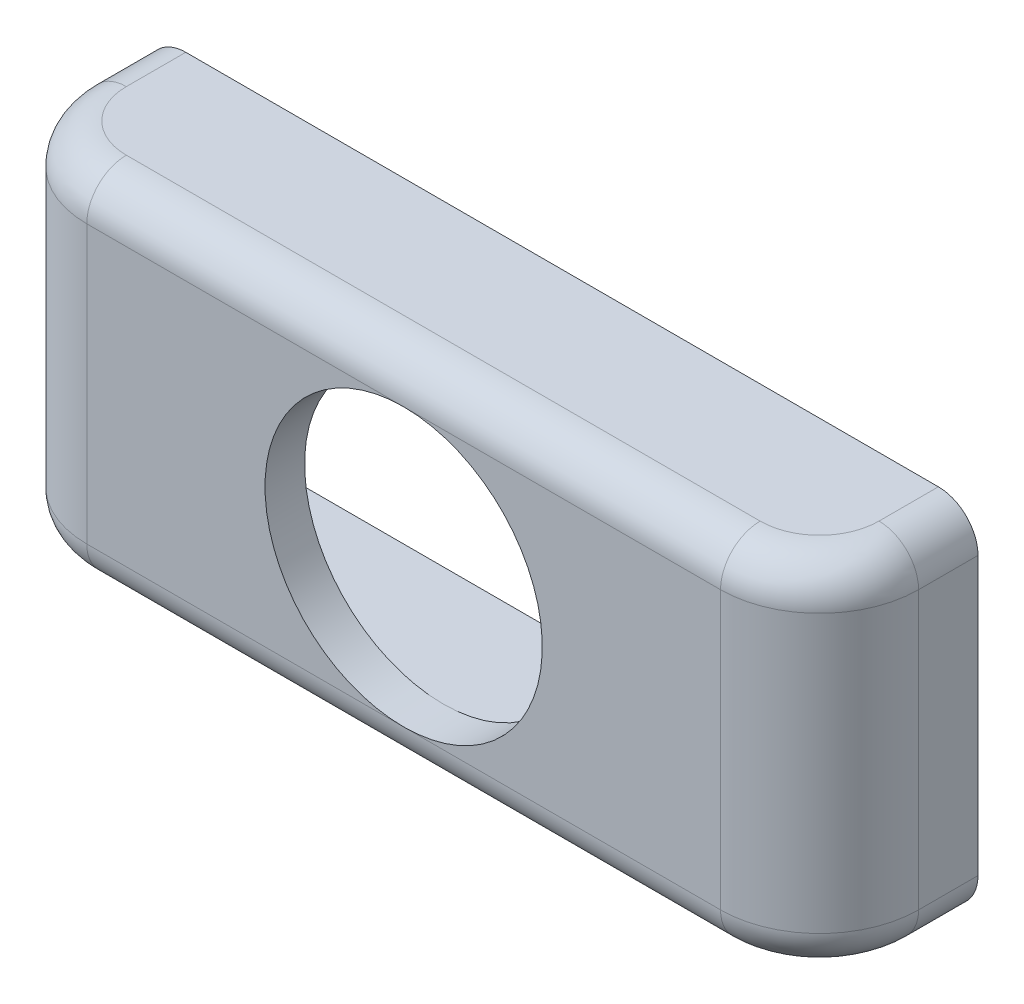
ISO-10303-21;
HEADER;
FILE_DESCRIPTION(('STEP AP214'),'2;1');
FILE_NAME('part.step','',(''),(''),'','','');
FILE_SCHEMA(('AUTOMOTIVE_DESIGN { 1 0 10303 214 1 1 1 1 }'));
ENDSEC;
DATA;
#1=APPLICATION_CONTEXT('core data for automotive mechanical design processes');
#2=APPLICATION_PROTOCOL_DEFINITION('international standard','automotive_design',2000,#1);
#3=PRODUCT_CONTEXT('',#1,'mechanical');
#4=PRODUCT('Part','Part','',(#3));
#5=PRODUCT_RELATED_PRODUCT_CATEGORY('part','',(#4));
#6=PRODUCT_DEFINITION_FORMATION('','',#4);
#7=PRODUCT_DEFINITION_CONTEXT('part definition',#1,'design');
#8=PRODUCT_DEFINITION('design','',#6,#7);
#9=PRODUCT_DEFINITION_SHAPE('','',#8);
#10=(LENGTH_UNIT() NAMED_UNIT(*) SI_UNIT(.MILLI.,.METRE.));
#11=(NAMED_UNIT(*) PLANE_ANGLE_UNIT() SI_UNIT($,.RADIAN.));
#12=(NAMED_UNIT(*) SI_UNIT($,.STERADIAN.) SOLID_ANGLE_UNIT());
#13=UNCERTAINTY_MEASURE_WITH_UNIT(LENGTH_MEASURE(1.E-05),#10,'distance_accuracy_value','');
#14=(GEOMETRIC_REPRESENTATION_CONTEXT(3) GLOBAL_UNCERTAINTY_ASSIGNED_CONTEXT((#13)) GLOBAL_UNIT_ASSIGNED_CONTEXT((#10,
#11,#12)) REPRESENTATION_CONTEXT('',''));
#15=CARTESIAN_POINT('',(0.,0.,0.));
#16=DIRECTION('',(0.,0.,1.));
#17=DIRECTION('',(1.,0.,0.));
#18=AXIS2_PLACEMENT_3D('',#15,#16,#17);
#19=CARTESIAN_POINT('',(0.,0.,8.));
#20=DIRECTION('',(0.,0.,1.));
#21=DIRECTION('',(1.,0.,0.));
#22=AXIS2_PLACEMENT_3D('',#19,#20,#21);
#23=PLANE('',#22);
#24=CARTESIAN_POINT('',(0.,0.,8.));
#25=DIRECTION('',(0.,0.,1.));
#26=DIRECTION('',(1.,0.,0.));
#27=AXIS2_PLACEMENT_3D('',#24,#25,#26);
#28=CIRCLE('',#27,7.);
#29=CARTESIAN_POINT('',(0.,7.00000000000001,8.));
#30=VERTEX_POINT('',#29);
#31=CARTESIAN_POINT('',(0.,-6.9999999999999,8.));
#32=VERTEX_POINT('',#31);
#33=EDGE_CURVE('E58',#30,#32,#28,.T.);
#34=ORIENTED_EDGE('',*,*,#33,.F.);
#35=DIRECTION('',(1.,0.,0.));
#36=VECTOR('',#35,1.);
#37=CARTESIAN_POINT('',(0.,7.00000000000001,8.));
#38=LINE('',#37,#36);
#39=CARTESIAN_POINT('',(-16.,7.00000000000001,8.));
#40=VERTEX_POINT('',#39);
#41=EDGE_CURVE('E187',#30,#40,#38,.F.);
#42=ORIENTED_EDGE('',*,*,#41,.T.);
#43=DIRECTION('',(0.,-1.,0.));
#44=VECTOR('',#43,1.);
#45=CARTESIAN_POINT('',(-16.,-8.9999999999999,8.));
#46=LINE('',#45,#44);
#47=CARTESIAN_POINT('',(-16.,-6.9999999999999,8.));
#48=VERTEX_POINT('',#47);
#49=EDGE_CURVE('E333',#40,#48,#46,.T.);
#50=ORIENTED_EDGE('',*,*,#49,.T.);
#51=DIRECTION('',(1.,0.,0.));
#52=VECTOR('',#51,1.);
#53=CARTESIAN_POINT('',(16.,-6.9999999999999,8.));
#54=LINE('',#53,#52);
#55=EDGE_CURVE('E190',#48,#32,#54,.T.);
#56=ORIENTED_EDGE('',*,*,#55,.T.);
#57=EDGE_LOOP('',(#34,#42,#50,#56));
#58=FACE_BOUND('',#57,.T.);
#59=ADVANCED_FACE('F43',(#58),#23,.T.);
#60=CARTESIAN_POINT('',(0.,0.,6.));
#61=DIRECTION('',(0.,0.,1.));
#62=DIRECTION('',(1.,0.,0.));
#63=AXIS2_PLACEMENT_3D('',#60,#61,#62);
#64=PLANE('',#63);
#65=DIRECTION('',(1.,0.,0.));
#66=VECTOR('',#65,1.);
#67=CARTESIAN_POINT('',(-21.,7.00000000000001,6.));
#68=LINE('',#67,#66);
#69=CARTESIAN_POINT('',(-16.,7.00000000000001,6.));
#70=VERTEX_POINT('',#69);
#71=CARTESIAN_POINT('',(0.,7.00000000000001,6.));
#72=VERTEX_POINT('',#71);
#73=EDGE_CURVE('E377',#70,#72,#68,.T.);
#74=ORIENTED_EDGE('',*,*,#73,.T.);
#75=CARTESIAN_POINT('',(0.,0.,6.));
#76=DIRECTION('',(0.,0.,1.));
#77=DIRECTION('',(1.,0.,0.));
#78=AXIS2_PLACEMENT_3D('',#75,#76,#77);
#79=CIRCLE('',#78,7.);
#80=CARTESIAN_POINT('',(0.,-6.9999999999999,6.));
#81=VERTEX_POINT('',#80);
#82=EDGE_CURVE('E11',#72,#81,#79,.T.);
#83=ORIENTED_EDGE('',*,*,#82,.T.);
#84=DIRECTION('',(1.,0.,0.));
#85=VECTOR('',#84,1.);
#86=CARTESIAN_POINT('',(-21.,-6.9999999999999,6.));
#87=LINE('',#86,#85);
#88=CARTESIAN_POINT('',(-16.,-6.9999999999999,6.));
#89=VERTEX_POINT('',#88);
#90=EDGE_CURVE('E241',#89,#81,#87,.T.);
#91=ORIENTED_EDGE('',*,*,#90,.F.);
#92=DIRECTION('',(0.,1.,0.));
#93=VECTOR('',#92,1.);
#94=CARTESIAN_POINT('',(-16.,0.,6.));
#95=LINE('',#94,#93);
#96=EDGE_CURVE('E369',#70,#89,#95,.F.);
#97=ORIENTED_EDGE('',*,*,#96,.F.);
#98=EDGE_LOOP('',(#74,#83,#91,#97));
#99=FACE_BOUND('',#98,.T.);
#100=ADVANCED_FACE('F429',(#99),#64,.F.);
#101=CARTESIAN_POINT('',(-21.,9.00000000000001,8.));
#102=DIRECTION('',(1.,0.,0.));
#103=DIRECTION('',(0.,1.,0.));
#104=AXIS2_PLACEMENT_3D('',#101,#102,#103);
#105=PLANE('',#104);
#106=DIRECTION('',(0.,-1.,0.));
#107=VECTOR('',#106,1.);
#108=CARTESIAN_POINT('',(-21.,9.00000000000001,0.));
#109=LINE('',#108,#107);
#110=CARTESIAN_POINT('',(-21.,7.00000000000001,0.));
#111=VERTEX_POINT('',#110);
#112=CARTESIAN_POINT('',(-21.,-6.9999999999999,0.));
#113=VERTEX_POINT('',#112);
#114=EDGE_CURVE('E236',#111,#113,#109,.T.);
#115=ORIENTED_EDGE('',*,*,#114,.T.);
#116=DIRECTION('',(0.,0.,-1.));
#117=VECTOR('',#116,1.);
#118=CARTESIAN_POINT('',(-21.,-6.9999999999999,8.));
#119=LINE('',#118,#117);
#120=CARTESIAN_POINT('',(-21.,-6.9999999999999,3.));
#121=VERTEX_POINT('',#120);
#122=EDGE_CURVE('E291',#113,#121,#119,.F.);
#123=ORIENTED_EDGE('',*,*,#122,.T.);
#124=DIRECTION('',(0.,-1.,0.));
#125=VECTOR('',#124,1.);
#126=CARTESIAN_POINT('',(-21.,9.00000000000001,3.));
#127=LINE('',#126,#125);
#128=CARTESIAN_POINT('',(-21.,7.00000000000001,3.));
#129=VERTEX_POINT('',#128);
#130=EDGE_CURVE('E329',#121,#129,#127,.F.);
#131=ORIENTED_EDGE('',*,*,#130,.T.);
#132=DIRECTION('',(0.,0.,-1.));
#133=VECTOR('',#132,1.);
#134=CARTESIAN_POINT('',(-21.,7.00000000000001,0.));
#135=LINE('',#134,#133);
#136=EDGE_CURVE('E294',#129,#111,#135,.T.);
#137=ORIENTED_EDGE('',*,*,#136,.T.);
#138=EDGE_LOOP('',(#115,#123,#131,#137));
#139=FACE_BOUND('',#138,.T.);
#140=ADVANCED_FACE('F467',(#139),#105,.F.);
#141=CARTESIAN_POINT('',(-21.,-8.9999999999999,8.));
#142=DIRECTION('',(0.,1.,0.));
#143=DIRECTION('',(0.,0.,1.));
#144=AXIS2_PLACEMENT_3D('',#141,#142,#143);
#145=PLANE('',#144);
#146=CARTESIAN_POINT('',(-16.,-8.9999999999999,3.));
#147=DIRECTION('',(0.,1.,0.));
#148=DIRECTION('',(0.,0.,1.));
#149=AXIS2_PLACEMENT_3D('',#146,#147,#148);
#150=CIRCLE('',#149,3.);
#151=CARTESIAN_POINT('',(-16.,-8.9999999999999,6.));
#152=VERTEX_POINT('',#151);
#153=CARTESIAN_POINT('',(-19.,-8.9999999999999,3.));
#154=VERTEX_POINT('',#153);
#155=EDGE_CURVE('E313',#152,#154,#150,.F.);
#156=ORIENTED_EDGE('',*,*,#155,.T.);
#157=DIRECTION('',(0.,0.,-1.));
#158=VECTOR('',#157,1.);
#159=CARTESIAN_POINT('',(-19.,-8.9999999999999,8.));
#160=LINE('',#159,#158);
#161=CARTESIAN_POINT('',(-19.,-8.9999999999999,0.));
#162=VERTEX_POINT('',#161);
#163=EDGE_CURVE('E309',#154,#162,#160,.T.);
#164=ORIENTED_EDGE('',*,*,#163,.T.);
#165=DIRECTION('',(1.,0.,0.));
#166=VECTOR('',#165,1.);
#167=CARTESIAN_POINT('',(-21.,-8.9999999999999,0.));
#168=LINE('',#167,#166);
#169=CARTESIAN_POINT('',(19.,-8.9999999999999,0.));
#170=VERTEX_POINT('',#169);
#171=EDGE_CURVE('E345',#162,#170,#168,.T.);
#172=ORIENTED_EDGE('',*,*,#171,.T.);
#173=DIRECTION('',(0.,0.,-1.));
#174=VECTOR('',#173,1.);
#175=CARTESIAN_POINT('',(19.,-8.9999999999999,3.));
#176=LINE('',#175,#174);
#177=CARTESIAN_POINT('',(19.,-8.9999999999999,3.));
#178=VERTEX_POINT('',#177);
#179=EDGE_CURVE('E316',#170,#178,#176,.F.);
#180=ORIENTED_EDGE('',*,*,#179,.T.);
#181=CARTESIAN_POINT('',(16.,-8.9999999999999,3.));
#182=DIRECTION('',(0.,1.,0.));
#183=DIRECTION('',(0.,0.,1.));
#184=AXIS2_PLACEMENT_3D('',#181,#182,#183);
#185=CIRCLE('',#184,3.);
#186=CARTESIAN_POINT('',(16.,-8.9999999999999,6.));
#187=VERTEX_POINT('',#186);
#188=EDGE_CURVE('E319',#178,#187,#185,.F.);
#189=ORIENTED_EDGE('',*,*,#188,.T.);
#190=DIRECTION('',(1.,0.,0.));
#191=VECTOR('',#190,1.);
#192=CARTESIAN_POINT('',(-16.,-8.9999999999999,6.));
#193=LINE('',#192,#191);
#194=EDGE_CURVE('E322',#187,#152,#193,.F.);
#195=ORIENTED_EDGE('',*,*,#194,.T.);
#196=EDGE_LOOP('',(#156,#164,#172,#180,#189,#195));
#197=FACE_BOUND('',#196,.T.);
#198=ADVANCED_FACE('F482',(#197),#145,.F.);
#199=CARTESIAN_POINT('',(21.,9.00000000000001,8.));
#200=DIRECTION('',(1.,0.,0.));
#201=DIRECTION('',(0.,0.,-1.));
#202=AXIS2_PLACEMENT_3D('',#199,#200,#201);
#203=PLANE('',#202);
#204=DIRECTION('',(0.,-1.,0.));
#205=VECTOR('',#204,1.);
#206=CARTESIAN_POINT('',(21.,9.00000000000001,3.));
#207=LINE('',#206,#205);
#208=CARTESIAN_POINT('',(21.,7.00000000000001,3.));
#209=VERTEX_POINT('',#208);
#210=CARTESIAN_POINT('',(21.,-6.9999999999999,3.));
#211=VERTEX_POINT('',#210);
#212=EDGE_CURVE('E325',#209,#211,#207,.T.);
#213=ORIENTED_EDGE('',*,*,#212,.T.);
#214=DIRECTION('',(0.,0.,-1.));
#215=VECTOR('',#214,1.);
#216=CARTESIAN_POINT('',(21.,-6.9999999999999,0.));
#217=LINE('',#216,#215);
#218=CARTESIAN_POINT('',(21.,-6.9999999999999,0.));
#219=VERTEX_POINT('',#218);
#220=EDGE_CURVE('E280',#211,#219,#217,.T.);
#221=ORIENTED_EDGE('',*,*,#220,.T.);
#222=DIRECTION('',(0.,-1.,0.));
#223=VECTOR('',#222,1.);
#224=CARTESIAN_POINT('',(21.,9.00000000000001,0.));
#225=LINE('',#224,#223);
#226=CARTESIAN_POINT('',(21.,7.00000000000001,0.));
#227=VERTEX_POINT('',#226);
#228=EDGE_CURVE('E341',#227,#219,#225,.T.);
#229=ORIENTED_EDGE('',*,*,#228,.F.);
#230=DIRECTION('',(0.,0.,-1.));
#231=VECTOR('',#230,1.);
#232=CARTESIAN_POINT('',(21.,7.00000000000001,8.));
#233=LINE('',#232,#231);
#234=EDGE_CURVE('E259',#227,#209,#233,.F.);
#235=ORIENTED_EDGE('',*,*,#234,.T.);
#236=EDGE_LOOP('',(#213,#221,#229,#235));
#237=FACE_BOUND('',#236,.T.);
#238=ADVANCED_FACE('F477',(#237),#203,.T.);
#239=CARTESIAN_POINT('',(-21.,9.00000000000001,8.));
#240=DIRECTION('',(0.,1.,0.));
#241=DIRECTION('',(0.,0.,1.));
#242=AXIS2_PLACEMENT_3D('',#239,#240,#241);
#243=PLANE('',#242);
#244=DIRECTION('',(1.,0.,0.));
#245=VECTOR('',#244,1.);
#246=CARTESIAN_POINT('',(-21.,9.00000000000001,0.));
#247=LINE('',#246,#245);
#248=CARTESIAN_POINT('',(-19.,9.00000000000001,0.));
#249=VERTEX_POINT('',#248);
#250=CARTESIAN_POINT('',(19.,9.00000000000001,0.));
#251=VERTEX_POINT('',#250);
#252=EDGE_CURVE('E338',#249,#251,#247,.T.);
#253=ORIENTED_EDGE('',*,*,#252,.F.);
#254=DIRECTION('',(0.,0.,-1.));
#255=VECTOR('',#254,1.);
#256=CARTESIAN_POINT('',(-19.,9.00000000000001,3.));
#257=LINE('',#256,#255);
#258=CARTESIAN_POINT('',(-19.,9.00000000000001,3.));
#259=VERTEX_POINT('',#258);
#260=EDGE_CURVE('E204',#249,#259,#257,.F.);
#261=ORIENTED_EDGE('',*,*,#260,.T.);
#262=CARTESIAN_POINT('',(-16.,9.00000000000001,3.));
#263=DIRECTION('',(0.,1.,0.));
#264=DIRECTION('',(0.,0.,1.));
#265=AXIS2_PLACEMENT_3D('',#262,#263,#264);
#266=CIRCLE('',#265,3.);
#267=CARTESIAN_POINT('',(-16.,9.00000000000001,6.));
#268=VERTEX_POINT('',#267);
#269=EDGE_CURVE('E266',#259,#268,#266,.T.);
#270=ORIENTED_EDGE('',*,*,#269,.T.);
#271=DIRECTION('',(1.,0.,0.));
#272=VECTOR('',#271,1.);
#273=CARTESIAN_POINT('',(-21.,9.00000000000001,6.));
#274=LINE('',#273,#272);
#275=CARTESIAN_POINT('',(16.,9.00000000000001,6.));
#276=VERTEX_POINT('',#275);
#277=EDGE_CURVE('E270',#268,#276,#274,.T.);
#278=ORIENTED_EDGE('',*,*,#277,.T.);
#279=CARTESIAN_POINT('',(16.,9.00000000000001,3.));
#280=DIRECTION('',(0.,1.,0.));
#281=DIRECTION('',(0.,0.,1.));
#282=AXIS2_PLACEMENT_3D('',#279,#280,#281);
#283=CIRCLE('',#282,3.);
#284=CARTESIAN_POINT('',(19.,9.00000000000001,3.));
#285=VERTEX_POINT('',#284);
#286=EDGE_CURVE('E253',#276,#285,#283,.T.);
#287=ORIENTED_EDGE('',*,*,#286,.T.);
#288=DIRECTION('',(0.,0.,-1.));
#289=VECTOR('',#288,1.);
#290=CARTESIAN_POINT('',(19.,9.00000000000001,8.));
#291=LINE('',#290,#289);
#292=EDGE_CURVE('E260',#285,#251,#291,.T.);
#293=ORIENTED_EDGE('',*,*,#292,.T.);
#294=EDGE_LOOP('',(#253,#261,#270,#278,#287,#293));
#295=FACE_BOUND('',#294,.T.);
#296=ADVANCED_FACE('F471',(#295),#243,.T.);
#297=EDGE_CURVE('E176',#32,#30,#28,.T.);
#298=ORIENTED_EDGE('',*,*,#297,.F.);
#299=CARTESIAN_POINT('',(16.,-6.9999999999999,8.));
#300=VERTEX_POINT('',#299);
#301=EDGE_CURVE('E212',#32,#300,#54,.T.);
#302=ORIENTED_EDGE('',*,*,#301,.T.);
#303=DIRECTION('',(0.,-1.,0.));
#304=VECTOR('',#303,1.);
#305=CARTESIAN_POINT('',(16.,0.,8.));
#306=LINE('',#305,#304);
#307=CARTESIAN_POINT('',(16.,7.00000000000001,8.));
#308=VERTEX_POINT('',#307);
#309=EDGE_CURVE('E209',#300,#308,#306,.F.);
#310=ORIENTED_EDGE('',*,*,#309,.T.);
#311=EDGE_CURVE('E198',#308,#30,#38,.F.);
#312=ORIENTED_EDGE('',*,*,#311,.T.);
#313=EDGE_LOOP('',(#298,#302,#310,#312));
#314=FACE_BOUND('',#313,.T.);
#315=ADVANCED_FACE('F207',(#314),#23,.T.);
#316=CARTESIAN_POINT('',(0.,0.,0.));
#317=DIRECTION('',(0.,0.,1.));
#318=DIRECTION('',(1.,0.,0.));
#319=AXIS2_PLACEMENT_3D('',#316,#317,#318);
#320=PLANE('',#319);
#321=DIRECTION('',(0.,-1.,0.));
#322=VECTOR('',#321,1.);
#323=CARTESIAN_POINT('',(-19.,9.00000000000001,0.));
#324=LINE('',#323,#322);
#325=CARTESIAN_POINT('',(-19.,7.00000000000001,0.));
#326=VERTEX_POINT('',#325);
#327=CARTESIAN_POINT('',(-19.,-6.9999999999999,0.));
#328=VERTEX_POINT('',#327);
#329=EDGE_CURVE('E192',#326,#328,#324,.T.);
#330=ORIENTED_EDGE('',*,*,#329,.T.);
#331=DIRECTION('',(1.,0.,0.));
#332=VECTOR('',#331,1.);
#333=CARTESIAN_POINT('',(-21.,-6.9999999999999,0.));
#334=LINE('',#333,#332);
#335=CARTESIAN_POINT('',(19.,-6.9999999999999,0.));
#336=VERTEX_POINT('',#335);
#337=EDGE_CURVE('E352',#328,#336,#334,.T.);
#338=ORIENTED_EDGE('',*,*,#337,.T.);
#339=DIRECTION('',(0.,-1.,0.));
#340=VECTOR('',#339,1.);
#341=CARTESIAN_POINT('',(19.,9.00000000000001,0.));
#342=LINE('',#341,#340);
#343=CARTESIAN_POINT('',(19.,7.00000000000001,0.));
#344=VERTEX_POINT('',#343);
#345=EDGE_CURVE('E355',#344,#336,#342,.T.);
#346=ORIENTED_EDGE('',*,*,#345,.F.);
#347=DIRECTION('',(1.,0.,0.));
#348=VECTOR('',#347,1.);
#349=CARTESIAN_POINT('',(-21.,7.00000000000001,0.));
#350=LINE('',#349,#348);
#351=EDGE_CURVE('E359',#326,#344,#350,.T.);
#352=ORIENTED_EDGE('',*,*,#351,.F.);
#353=EDGE_LOOP('',(#330,#338,#346,#352));
#354=FACE_BOUND('',#353,.T.);
#355=ORIENTED_EDGE('',*,*,#171,.F.);
#356=CARTESIAN_POINT('',(-19.,-6.9999999999999,0.));
#357=DIRECTION('',(0.,0.,1.));
#358=DIRECTION('',(1.,0.,0.));
#359=AXIS2_PLACEMENT_3D('',#356,#357,#358);
#360=CIRCLE('',#359,2.);
#361=EDGE_CURVE('E298',#162,#113,#360,.F.);
#362=ORIENTED_EDGE('',*,*,#361,.T.);
#363=ORIENTED_EDGE('',*,*,#114,.F.);
#364=CARTESIAN_POINT('',(-19.,7.00000000000001,0.));
#365=DIRECTION('',(0.,0.,1.));
#366=DIRECTION('',(1.,0.,0.));
#367=AXIS2_PLACEMENT_3D('',#364,#365,#366);
#368=CIRCLE('',#367,2.);
#369=EDGE_CURVE('E304',#111,#249,#368,.F.);
#370=ORIENTED_EDGE('',*,*,#369,.T.);
#371=ORIENTED_EDGE('',*,*,#252,.T.);
#372=CARTESIAN_POINT('',(19.,7.00000000000001,0.));
#373=DIRECTION('',(0.,0.,1.));
#374=DIRECTION('',(1.,0.,0.));
#375=AXIS2_PLACEMENT_3D('',#372,#373,#374);
#376=CIRCLE('',#375,2.);
#377=EDGE_CURVE('E261',#251,#227,#376,.F.);
#378=ORIENTED_EDGE('',*,*,#377,.T.);
#379=ORIENTED_EDGE('',*,*,#228,.T.);
#380=CARTESIAN_POINT('',(19.,-6.9999999999999,0.));
#381=DIRECTION('',(0.,0.,1.));
#382=DIRECTION('',(1.,0.,0.));
#383=AXIS2_PLACEMENT_3D('',#380,#381,#382);
#384=CIRCLE('',#383,2.);
#385=EDGE_CURVE('E301',#219,#170,#384,.F.);
#386=ORIENTED_EDGE('',*,*,#385,.T.);
#387=EDGE_LOOP('',(#355,#362,#363,#370,#371,#378,#379,#386));
#388=FACE_BOUND('',#387,.T.);
#389=ADVANCED_FACE('F448',(#354,#388),#320,.F.);
#390=CARTESIAN_POINT('',(-16.,0.,3.));
#391=DIRECTION('',(0.,1.,0.));
#392=DIRECTION('',(-1.,0.,0.));
#393=AXIS2_PLACEMENT_3D('',#390,#391,#392);
#394=CYLINDRICAL_SURFACE('',#393,5.);
#395=ORIENTED_EDGE('',*,*,#130,.F.);
#396=CARTESIAN_POINT('',(-16.,-6.9999999999999,3.));
#397=DIRECTION('',(0.,1.,0.));
#398=DIRECTION('',(0.,0.,1.));
#399=AXIS2_PLACEMENT_3D('',#396,#397,#398);
#400=CIRCLE('',#399,5.);
#401=EDGE_CURVE('E285',#121,#48,#400,.T.);
#402=ORIENTED_EDGE('',*,*,#401,.T.);
#403=ORIENTED_EDGE('',*,*,#49,.F.);
#404=CARTESIAN_POINT('',(-16.,7.00000000000001,3.));
#405=DIRECTION('',(0.,1.,0.));
#406=DIRECTION('',(0.,0.,1.));
#407=AXIS2_PLACEMENT_3D('',#404,#405,#406);
#408=CIRCLE('',#407,5.);
#409=EDGE_CURVE('E288',#40,#129,#408,.F.);
#410=ORIENTED_EDGE('',*,*,#409,.T.);
#411=EDGE_LOOP('',(#395,#402,#403,#410));
#412=FACE_BOUND('',#411,.T.);
#413=ADVANCED_FACE('F476',(#412),#394,.T.);
#414=CARTESIAN_POINT('',(16.,9.00000000000001,3.));
#415=DIRECTION('',(0.,-1.,0.));
#416=DIRECTION('',(0.,0.,-1.));
#417=AXIS2_PLACEMENT_3D('',#414,#415,#416);
#418=CYLINDRICAL_SURFACE('',#417,5.);
#419=ORIENTED_EDGE('',*,*,#309,.F.);
#420=CARTESIAN_POINT('',(16.,-6.9999999999999,3.));
#421=DIRECTION('',(0.,1.,0.));
#422=DIRECTION('',(0.,0.,1.));
#423=AXIS2_PLACEMENT_3D('',#420,#421,#422);
#424=CIRCLE('',#423,5.);
#425=EDGE_CURVE('E275',#300,#211,#424,.T.);
#426=ORIENTED_EDGE('',*,*,#425,.T.);
#427=ORIENTED_EDGE('',*,*,#212,.F.);
#428=CARTESIAN_POINT('',(16.,7.00000000000001,3.));
#429=DIRECTION('',(0.,1.,0.));
#430=DIRECTION('',(0.,0.,1.));
#431=AXIS2_PLACEMENT_3D('',#428,#429,#430);
#432=CIRCLE('',#431,5.);
#433=EDGE_CURVE('E254',#209,#308,#432,.F.);
#434=ORIENTED_EDGE('',*,*,#433,.T.);
#435=EDGE_LOOP('',(#419,#426,#427,#434));
#436=FACE_BOUND('',#435,.T.);
#437=ADVANCED_FACE('F494',(#436),#418,.T.);
#438=CARTESIAN_POINT('',(19.,-6.9999999999999,8.));
#439=DIRECTION('',(0.,0.,1.));
#440=DIRECTION('',(1.,0.,0.));
#441=AXIS2_PLACEMENT_3D('',#438,#439,#440);
#442=CYLINDRICAL_SURFACE('',#441,2.);
#443=ORIENTED_EDGE('',*,*,#385,.F.);
#444=ORIENTED_EDGE('',*,*,#220,.F.);
#445=CARTESIAN_POINT('',(19.,-6.9999999999999,3.));
#446=DIRECTION('',(0.,0.,1.));
#447=DIRECTION('',(1.,0.,0.));
#448=AXIS2_PLACEMENT_3D('',#445,#446,#447);
#449=CIRCLE('',#448,2.);
#450=EDGE_CURVE('E232',#178,#211,#449,.T.);
#451=ORIENTED_EDGE('',*,*,#450,.F.);
#452=ORIENTED_EDGE('',*,*,#179,.F.);
#453=EDGE_LOOP('',(#443,#444,#451,#452));
#454=FACE_BOUND('',#453,.T.);
#455=ADVANCED_FACE('F498',(#454),#442,.T.);
#456=CARTESIAN_POINT('',(16.,-6.9999999999999,3.));
#457=DIRECTION('',(0.,1.,0.));
#458=DIRECTION('',(0.,0.,1.));
#459=AXIS2_PLACEMENT_3D('',#456,#457,#458);
#460=TOROIDAL_SURFACE('',#459,3.,2.);
#461=ORIENTED_EDGE('',*,*,#450,.T.);
#462=ORIENTED_EDGE('',*,*,#425,.F.);
#463=CARTESIAN_POINT('',(16.,-6.9999999999999,6.));
#464=DIRECTION('',(-1.,0.,0.));
#465=DIRECTION('',(0.,0.,1.));
#466=AXIS2_PLACEMENT_3D('',#463,#464,#465);
#467=CIRCLE('',#466,2.);
#468=EDGE_CURVE('E228',#187,#300,#467,.T.);
#469=ORIENTED_EDGE('',*,*,#468,.F.);
#470=ORIENTED_EDGE('',*,*,#188,.F.);
#471=EDGE_LOOP('',(#461,#462,#469,#470));
#472=FACE_BOUND('',#471,.T.);
#473=ADVANCED_FACE('F511',(#472),#460,.T.);
#474=CARTESIAN_POINT('',(0.,-6.9999999999999,6.));
#475=DIRECTION('',(-1.,0.,0.));
#476=DIRECTION('',(0.,0.,1.));
#477=AXIS2_PLACEMENT_3D('',#474,#475,#476);
#478=CYLINDRICAL_SURFACE('',#477,2.);
#479=ORIENTED_EDGE('',*,*,#468,.T.);
#480=ORIENTED_EDGE('',*,*,#301,.F.);
#481=ORIENTED_EDGE('',*,*,#55,.F.);
#482=CARTESIAN_POINT('',(-16.,-6.9999999999999,6.));
#483=DIRECTION('',(-1.,0.,0.));
#484=DIRECTION('',(0.,0.,1.));
#485=AXIS2_PLACEMENT_3D('',#482,#483,#484);
#486=CIRCLE('',#485,2.);
#487=EDGE_CURVE('E223',#152,#48,#486,.T.);
#488=ORIENTED_EDGE('',*,*,#487,.F.);
#489=ORIENTED_EDGE('',*,*,#194,.F.);
#490=EDGE_LOOP('',(#479,#480,#481,#488,#489));
#491=FACE_BOUND('',#490,.T.);
#492=ADVANCED_FACE('F507',(#491),#478,.T.);
#493=CARTESIAN_POINT('',(-16.,-6.9999999999999,3.));
#494=DIRECTION('',(0.,1.,0.));
#495=DIRECTION('',(0.,0.,1.));
#496=AXIS2_PLACEMENT_3D('',#493,#494,#495);
#497=TOROIDAL_SURFACE('',#496,3.,2.);
#498=ORIENTED_EDGE('',*,*,#487,.T.);
#499=ORIENTED_EDGE('',*,*,#401,.F.);
#500=CARTESIAN_POINT('',(-19.,-6.9999999999999,3.));
#501=DIRECTION('',(0.,0.,-1.));
#502=DIRECTION('',(-1.,0.,0.));
#503=AXIS2_PLACEMENT_3D('',#500,#501,#502);
#504=CIRCLE('',#503,2.);
#505=EDGE_CURVE('E219',#154,#121,#504,.T.);
#506=ORIENTED_EDGE('',*,*,#505,.F.);
#507=ORIENTED_EDGE('',*,*,#155,.F.);
#508=EDGE_LOOP('',(#498,#499,#506,#507));
#509=FACE_BOUND('',#508,.T.);
#510=ADVANCED_FACE('F503',(#509),#497,.T.);
#511=CARTESIAN_POINT('',(-19.,-6.9999999999999,8.));
#512=DIRECTION('',(0.,0.,-1.));
#513=DIRECTION('',(-1.,0.,0.));
#514=AXIS2_PLACEMENT_3D('',#511,#512,#513);
#515=CYLINDRICAL_SURFACE('',#514,2.);
#516=ORIENTED_EDGE('',*,*,#505,.T.);
#517=ORIENTED_EDGE('',*,*,#122,.F.);
#518=ORIENTED_EDGE('',*,*,#361,.F.);
#519=ORIENTED_EDGE('',*,*,#163,.F.);
#520=EDGE_LOOP('',(#516,#517,#518,#519));
#521=FACE_BOUND('',#520,.T.);
#522=ADVANCED_FACE('F500',(#521),#515,.T.);
#523=CARTESIAN_POINT('',(19.,7.00000000000001,8.));
#524=DIRECTION('',(0.,0.,-1.));
#525=DIRECTION('',(-1.,0.,0.));
#526=AXIS2_PLACEMENT_3D('',#523,#524,#525);
#527=CYLINDRICAL_SURFACE('',#526,2.);
#528=ORIENTED_EDGE('',*,*,#377,.F.);
#529=ORIENTED_EDGE('',*,*,#292,.F.);
#530=CARTESIAN_POINT('',(19.,7.00000000000001,3.));
#531=DIRECTION('',(0.,0.,1.));
#532=DIRECTION('',(1.,0.,0.));
#533=AXIS2_PLACEMENT_3D('',#530,#531,#532);
#534=CIRCLE('',#533,2.);
#535=EDGE_CURVE('E224',#209,#285,#534,.T.);
#536=ORIENTED_EDGE('',*,*,#535,.F.);
#537=ORIENTED_EDGE('',*,*,#234,.F.);
#538=EDGE_LOOP('',(#528,#529,#536,#537));
#539=FACE_BOUND('',#538,.T.);
#540=ADVANCED_FACE('F45',(#539),#527,.T.);
#541=CARTESIAN_POINT('',(16.,7.00000000000001,3.));
#542=DIRECTION('',(0.,1.,0.));
#543=DIRECTION('',(0.,0.,1.));
#544=AXIS2_PLACEMENT_3D('',#541,#542,#543);
#545=TOROIDAL_SURFACE('',#544,3.,2.);
#546=ORIENTED_EDGE('',*,*,#535,.T.);
#547=ORIENTED_EDGE('',*,*,#286,.F.);
#548=CARTESIAN_POINT('',(16.,7.00000000000001,6.));
#549=DIRECTION('',(-1.,0.,0.));
#550=DIRECTION('',(0.,0.,1.));
#551=AXIS2_PLACEMENT_3D('',#548,#549,#550);
#552=CIRCLE('',#551,2.);
#553=EDGE_CURVE('E244',#308,#276,#552,.T.);
#554=ORIENTED_EDGE('',*,*,#553,.F.);
#555=ORIENTED_EDGE('',*,*,#433,.F.);
#556=EDGE_LOOP('',(#546,#547,#554,#555));
#557=FACE_BOUND('',#556,.T.);
#558=ADVANCED_FACE('F252',(#557),#545,.T.);
#559=CARTESIAN_POINT('',(-21.,7.00000000000001,6.));
#560=DIRECTION('',(1.,0.,0.));
#561=DIRECTION('',(0.,0.,-1.));
#562=AXIS2_PLACEMENT_3D('',#559,#560,#561);
#563=CYLINDRICAL_SURFACE('',#562,2.);
#564=ORIENTED_EDGE('',*,*,#553,.T.);
#565=ORIENTED_EDGE('',*,*,#277,.F.);
#566=CARTESIAN_POINT('',(-16.,7.00000000000001,6.));
#567=DIRECTION('',(-1.,0.,0.));
#568=DIRECTION('',(0.,0.,1.));
#569=AXIS2_PLACEMENT_3D('',#566,#567,#568);
#570=CIRCLE('',#569,2.);
#571=EDGE_CURVE('E201',#40,#268,#570,.T.);
#572=ORIENTED_EDGE('',*,*,#571,.F.);
#573=ORIENTED_EDGE('',*,*,#41,.F.);
#574=ORIENTED_EDGE('',*,*,#311,.F.);
#575=EDGE_LOOP('',(#564,#565,#572,#573,#574));
#576=FACE_BOUND('',#575,.T.);
#577=ADVANCED_FACE('F197',(#576),#563,.T.);
#578=CARTESIAN_POINT('',(-16.,7.00000000000001,3.));
#579=DIRECTION('',(0.,1.,0.));
#580=DIRECTION('',(0.,0.,1.));
#581=AXIS2_PLACEMENT_3D('',#578,#579,#580);
#582=TOROIDAL_SURFACE('',#581,3.,2.);
#583=ORIENTED_EDGE('',*,*,#571,.T.);
#584=ORIENTED_EDGE('',*,*,#269,.F.);
#585=CARTESIAN_POINT('',(-19.,7.00000000000001,3.));
#586=DIRECTION('',(0.,0.,-1.));
#587=DIRECTION('',(-1.,0.,0.));
#588=AXIS2_PLACEMENT_3D('',#585,#586,#587);
#589=CIRCLE('',#588,2.);
#590=EDGE_CURVE('E237',#129,#259,#589,.T.);
#591=ORIENTED_EDGE('',*,*,#590,.F.);
#592=ORIENTED_EDGE('',*,*,#409,.F.);
#593=EDGE_LOOP('',(#583,#584,#591,#592));
#594=FACE_BOUND('',#593,.T.);
#595=ADVANCED_FACE('F522',(#594),#582,.T.);
#596=CARTESIAN_POINT('',(-19.,7.00000000000001,8.));
#597=DIRECTION('',(0.,0.,1.));
#598=DIRECTION('',(1.,0.,0.));
#599=AXIS2_PLACEMENT_3D('',#596,#597,#598);
#600=CYLINDRICAL_SURFACE('',#599,2.);
#601=ORIENTED_EDGE('',*,*,#590,.T.);
#602=ORIENTED_EDGE('',*,*,#260,.F.);
#603=ORIENTED_EDGE('',*,*,#369,.F.);
#604=ORIENTED_EDGE('',*,*,#136,.F.);
#605=EDGE_LOOP('',(#601,#602,#603,#604));
#606=FACE_BOUND('',#605,.T.);
#607=ADVANCED_FACE('F519',(#606),#600,.T.);
#608=CARTESIAN_POINT('',(-19.,9.00000000000001,8.));
#609=DIRECTION('',(1.,0.,0.));
#610=DIRECTION('',(0.,1.,0.));
#611=AXIS2_PLACEMENT_3D('',#608,#609,#610);
#612=PLANE('',#611);
#613=ORIENTED_EDGE('',*,*,#329,.F.);
#614=DIRECTION('',(0.,0.,1.));
#615=VECTOR('',#614,1.);
#616=CARTESIAN_POINT('',(-19.,7.00000000000001,8.));
#617=LINE('',#616,#615);
#618=CARTESIAN_POINT('',(-19.,7.00000000000001,3.));
#619=VERTEX_POINT('',#618);
#620=EDGE_CURVE('E385',#326,#619,#617,.T.);
#621=ORIENTED_EDGE('',*,*,#620,.T.);
#622=DIRECTION('',(0.,1.,0.));
#623=VECTOR('',#622,1.);
#624=CARTESIAN_POINT('',(-19.,9.00000000000001,3.));
#625=LINE('',#624,#623);
#626=CARTESIAN_POINT('',(-19.,-6.9999999999999,3.));
#627=VERTEX_POINT('',#626);
#628=EDGE_CURVE('E372',#627,#619,#625,.T.);
#629=ORIENTED_EDGE('',*,*,#628,.F.);
#630=DIRECTION('',(0.,0.,1.));
#631=VECTOR('',#630,1.);
#632=CARTESIAN_POINT('',(-19.,-6.9999999999999,8.));
#633=LINE('',#632,#631);
#634=EDGE_CURVE('E392',#328,#627,#633,.T.);
#635=ORIENTED_EDGE('',*,*,#634,.F.);
#636=EDGE_LOOP('',(#613,#621,#629,#635));
#637=FACE_BOUND('',#636,.T.);
#638=ADVANCED_FACE('F450',(#637),#612,.T.);
#639=CARTESIAN_POINT('',(-21.,-6.9999999999999,8.));
#640=DIRECTION('',(0.,1.,0.));
#641=DIRECTION('',(0.,0.,1.));
#642=AXIS2_PLACEMENT_3D('',#639,#640,#641);
#643=PLANE('',#642);
#644=ORIENTED_EDGE('',*,*,#90,.T.);
#645=CARTESIAN_POINT('',(16.,-6.9999999999999,6.));
#646=VERTEX_POINT('',#645);
#647=EDGE_CURVE('E396',#81,#646,#87,.T.);
#648=ORIENTED_EDGE('',*,*,#647,.T.);
#649=CARTESIAN_POINT('',(16.,-6.9999999999999,3.));
#650=DIRECTION('',(0.,1.,0.));
#651=DIRECTION('',(0.,0.,1.));
#652=AXIS2_PLACEMENT_3D('',#649,#650,#651);
#653=CIRCLE('',#652,3.);
#654=CARTESIAN_POINT('',(19.,-6.9999999999999,3.));
#655=VERTEX_POINT('',#654);
#656=EDGE_CURVE('E397',#646,#655,#653,.T.);
#657=ORIENTED_EDGE('',*,*,#656,.T.);
#658=DIRECTION('',(0.,0.,-1.));
#659=VECTOR('',#658,1.);
#660=CARTESIAN_POINT('',(19.,-6.9999999999999,8.));
#661=LINE('',#660,#659);
#662=EDGE_CURVE('E401',#655,#336,#661,.T.);
#663=ORIENTED_EDGE('',*,*,#662,.T.);
#664=ORIENTED_EDGE('',*,*,#337,.F.);
#665=ORIENTED_EDGE('',*,*,#634,.T.);
#666=CARTESIAN_POINT('',(-16.,-6.9999999999999,3.));
#667=DIRECTION('',(0.,1.,0.));
#668=DIRECTION('',(0.,0.,1.));
#669=AXIS2_PLACEMENT_3D('',#666,#667,#668);
#670=CIRCLE('',#669,3.);
#671=EDGE_CURVE('E405',#627,#89,#670,.T.);
#672=ORIENTED_EDGE('',*,*,#671,.T.);
#673=EDGE_LOOP('',(#644,#648,#657,#663,#664,#665,#672));
#674=FACE_BOUND('',#673,.T.);
#675=ADVANCED_FACE('F419',(#674),#643,.T.);
#676=CARTESIAN_POINT('',(19.,9.00000000000001,8.));
#677=DIRECTION('',(1.,0.,0.));
#678=DIRECTION('',(0.,0.,-1.));
#679=AXIS2_PLACEMENT_3D('',#676,#677,#678);
#680=PLANE('',#679);
#681=DIRECTION('',(0.,1.,0.));
#682=VECTOR('',#681,1.);
#683=CARTESIAN_POINT('',(19.,9.00000000000001,3.));
#684=LINE('',#683,#682);
#685=CARTESIAN_POINT('',(19.,7.00000000000001,3.));
#686=VERTEX_POINT('',#685);
#687=EDGE_CURVE('E389',#686,#655,#684,.F.);
#688=ORIENTED_EDGE('',*,*,#687,.F.);
#689=DIRECTION('',(0.,0.,-1.));
#690=VECTOR('',#689,1.);
#691=CARTESIAN_POINT('',(19.,7.00000000000001,8.));
#692=LINE('',#691,#690);
#693=EDGE_CURVE('E376',#686,#344,#692,.T.);
#694=ORIENTED_EDGE('',*,*,#693,.T.);
#695=ORIENTED_EDGE('',*,*,#345,.T.);
#696=ORIENTED_EDGE('',*,*,#662,.F.);
#697=EDGE_LOOP('',(#688,#694,#695,#696));
#698=FACE_BOUND('',#697,.T.);
#699=ADVANCED_FACE('F444',(#698),#680,.F.);
#700=CARTESIAN_POINT('',(-21.,7.00000000000001,8.));
#701=DIRECTION('',(0.,1.,0.));
#702=DIRECTION('',(0.,0.,1.));
#703=AXIS2_PLACEMENT_3D('',#700,#701,#702);
#704=PLANE('',#703);
#705=ORIENTED_EDGE('',*,*,#351,.T.);
#706=ORIENTED_EDGE('',*,*,#693,.F.);
#707=CARTESIAN_POINT('',(16.,7.00000000000001,3.));
#708=DIRECTION('',(0.,1.,0.));
#709=DIRECTION('',(0.,0.,1.));
#710=AXIS2_PLACEMENT_3D('',#707,#708,#709);
#711=CIRCLE('',#710,3.);
#712=CARTESIAN_POINT('',(16.,7.00000000000001,6.));
#713=VERTEX_POINT('',#712);
#714=EDGE_CURVE('E373',#713,#686,#711,.T.);
#715=ORIENTED_EDGE('',*,*,#714,.F.);
#716=EDGE_CURVE('E381',#72,#713,#68,.T.);
#717=ORIENTED_EDGE('',*,*,#716,.F.);
#718=ORIENTED_EDGE('',*,*,#73,.F.);
#719=CARTESIAN_POINT('',(-16.,7.00000000000001,3.));
#720=DIRECTION('',(0.,1.,0.));
#721=DIRECTION('',(0.,0.,1.));
#722=AXIS2_PLACEMENT_3D('',#719,#720,#721);
#723=CIRCLE('',#722,3.);
#724=EDGE_CURVE('E382',#619,#70,#723,.T.);
#725=ORIENTED_EDGE('',*,*,#724,.F.);
#726=ORIENTED_EDGE('',*,*,#620,.F.);
#727=EDGE_LOOP('',(#705,#706,#715,#717,#718,#725,#726));
#728=FACE_BOUND('',#727,.T.);
#729=ADVANCED_FACE('F452',(#728),#704,.F.);
#730=ORIENTED_EDGE('',*,*,#647,.F.);
#731=EDGE_CURVE('E47',#81,#72,#79,.T.);
#732=ORIENTED_EDGE('',*,*,#731,.T.);
#733=ORIENTED_EDGE('',*,*,#716,.T.);
#734=DIRECTION('',(0.,1.,0.));
#735=VECTOR('',#734,1.);
#736=CARTESIAN_POINT('',(16.,0.,6.));
#737=LINE('',#736,#735);
#738=EDGE_CURVE('E362',#646,#713,#737,.T.);
#739=ORIENTED_EDGE('',*,*,#738,.F.);
#740=EDGE_LOOP('',(#730,#732,#733,#739));
#741=FACE_BOUND('',#740,.T.);
#742=ADVANCED_FACE('F436',(#741),#64,.F.);
#743=CARTESIAN_POINT('',(-16.,0.,3.));
#744=DIRECTION('',(0.,1.,0.));
#745=DIRECTION('',(-1.,0.,0.));
#746=AXIS2_PLACEMENT_3D('',#743,#744,#745);
#747=CYLINDRICAL_SURFACE('',#746,3.);
#748=ORIENTED_EDGE('',*,*,#628,.T.);
#749=ORIENTED_EDGE('',*,*,#724,.T.);
#750=ORIENTED_EDGE('',*,*,#96,.T.);
#751=ORIENTED_EDGE('',*,*,#671,.F.);
#752=EDGE_LOOP('',(#748,#749,#750,#751));
#753=FACE_BOUND('',#752,.T.);
#754=ADVANCED_FACE('F424',(#753),#747,.F.);
#755=CARTESIAN_POINT('',(16.,9.00000000000001,3.));
#756=DIRECTION('',(0.,-1.,0.));
#757=DIRECTION('',(0.,0.,-1.));
#758=AXIS2_PLACEMENT_3D('',#755,#756,#757);
#759=CYLINDRICAL_SURFACE('',#758,3.);
#760=ORIENTED_EDGE('',*,*,#738,.T.);
#761=ORIENTED_EDGE('',*,*,#714,.T.);
#762=ORIENTED_EDGE('',*,*,#687,.T.);
#763=ORIENTED_EDGE('',*,*,#656,.F.);
#764=EDGE_LOOP('',(#760,#761,#762,#763));
#765=FACE_BOUND('',#764,.T.);
#766=ADVANCED_FACE('F440',(#765),#759,.F.);
#767=CARTESIAN_POINT('',(0.,0.,0.));
#768=DIRECTION('',(0.,0.,1.));
#769=DIRECTION('',(1.,0.,0.));
#770=AXIS2_PLACEMENT_3D('',#767,#768,#769);
#771=CYLINDRICAL_SURFACE('',#770,7.);
#772=ORIENTED_EDGE('',*,*,#33,.T.);
#773=ORIENTED_EDGE('',*,*,#297,.T.);
#774=EDGE_LOOP('',(#772,#773));
#775=FACE_BOUND('',#774,.T.);
#776=ORIENTED_EDGE('',*,*,#731,.F.);
#777=ORIENTED_EDGE('',*,*,#82,.F.);
#778=EDGE_LOOP('',(#776,#777));
#779=FACE_BOUND('',#778,.T.);
#780=ADVANCED_FACE('F177',(#775,#779),#771,.F.);
#781=CLOSED_SHELL('',(#59,#100,#140,#198,#238,#296,#315,#389,#413,#437,#455,#473,#492,#510,#522,
#540,#558,#577,#595,#607,#638,#675,#699,#729,#742,#754,#766,#780));
#782=MANIFOLD_SOLID_BREP('B2',#781);
#783=ADVANCED_BREP_SHAPE_REPRESENTATION('',(#18,#782),#14);
#784=SHAPE_DEFINITION_REPRESENTATION(#9,#783);
ENDSEC;
END-ISO-10303-21;
